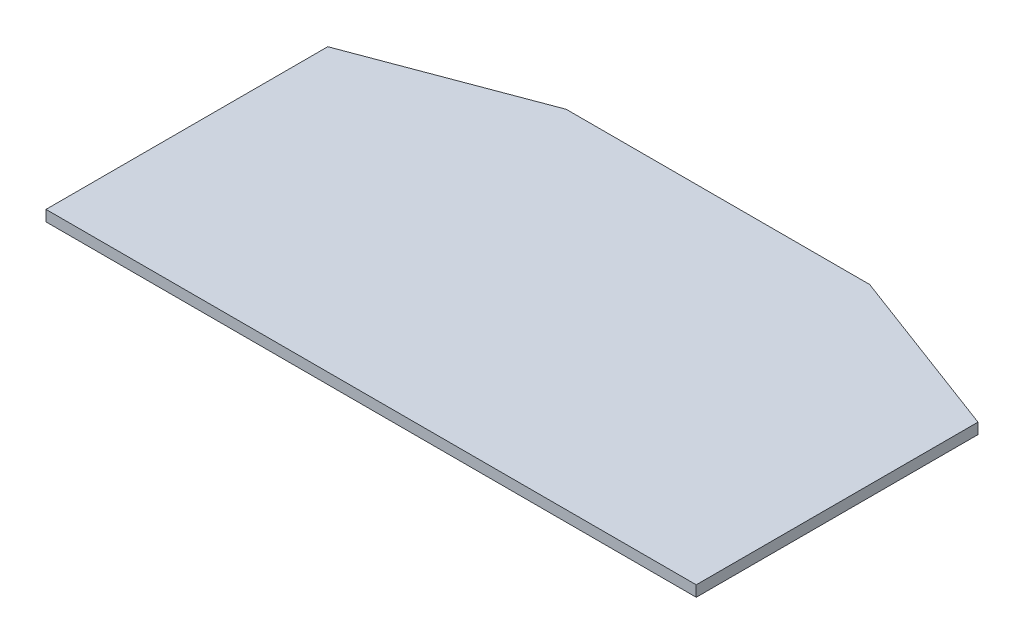
ISO-10303-21;
HEADER;
FILE_DESCRIPTION(('STEP AP214'),'2;1');
FILE_NAME('part.step','',(''),(''),'','','');
FILE_SCHEMA(('AUTOMOTIVE_DESIGN { 1 0 10303 214 1 1 1 1 }'));
ENDSEC;
DATA;
#1=APPLICATION_CONTEXT('core data for automotive mechanical design processes');
#2=APPLICATION_PROTOCOL_DEFINITION('international standard','automotive_design',2000,#1);
#3=PRODUCT_CONTEXT('',#1,'mechanical');
#4=PRODUCT('Part','Part','',(#3));
#5=PRODUCT_RELATED_PRODUCT_CATEGORY('part','',(#4));
#6=PRODUCT_DEFINITION_FORMATION('','',#4);
#7=PRODUCT_DEFINITION_CONTEXT('part definition',#1,'design');
#8=PRODUCT_DEFINITION('design','',#6,#7);
#9=PRODUCT_DEFINITION_SHAPE('','',#8);
#10=(LENGTH_UNIT() NAMED_UNIT(*) SI_UNIT(.MILLI.,.METRE.));
#11=(NAMED_UNIT(*) PLANE_ANGLE_UNIT() SI_UNIT($,.RADIAN.));
#12=(NAMED_UNIT(*) SI_UNIT($,.STERADIAN.) SOLID_ANGLE_UNIT());
#13=UNCERTAINTY_MEASURE_WITH_UNIT(LENGTH_MEASURE(1.E-05),#10,'distance_accuracy_value','');
#14=(GEOMETRIC_REPRESENTATION_CONTEXT(3) GLOBAL_UNCERTAINTY_ASSIGNED_CONTEXT((#13)) GLOBAL_UNIT_ASSIGNED_CONTEXT((#10,
#11,#12)) REPRESENTATION_CONTEXT('',''));
#15=CARTESIAN_POINT('',(0.,0.,0.));
#16=DIRECTION('',(0.,0.,1.));
#17=DIRECTION('',(1.,0.,0.));
#18=AXIS2_PLACEMENT_3D('',#15,#16,#17);
#19=CARTESIAN_POINT('',(-92.921646993215,12.7,-89.0184341791368));
#20=DIRECTION('',(1.,0.,0.));
#21=DIRECTION('',(0.,0.,-1.));
#22=AXIS2_PLACEMENT_3D('',#19,#20,#21);
#23=PLANE('',#22);
#24=DIRECTION('',(0.,0.,1.));
#25=VECTOR('',#24,1.);
#26=CARTESIAN_POINT('',(-92.921646993215,0.,-89.0184341791368));
#27=LINE('',#26,#25);
#28=CARTESIAN_POINT('',(-92.921646993215,0.,-419.218434179137));
#29=VERTEX_POINT('',#28);
#30=CARTESIAN_POINT('',(-92.921646993215,0.,-89.0184341791368));
#31=VERTEX_POINT('',#30);
#32=EDGE_CURVE('E117',#29,#31,#27,.T.);
#33=ORIENTED_EDGE('',*,*,#32,.T.);
#34=DIRECTION('',(0.,-1.,0.));
#35=VECTOR('',#34,1.);
#36=CARTESIAN_POINT('',(-92.921646993215,12.7,-89.0184341791368));
#37=LINE('',#36,#35);
#38=CARTESIAN_POINT('',(-92.921646993215,12.7,-89.0184341791368));
#39=VERTEX_POINT('',#38);
#40=EDGE_CURVE('E11',#39,#31,#37,.T.);
#41=ORIENTED_EDGE('',*,*,#40,.F.);
#42=DIRECTION('',(0.,0.,1.));
#43=VECTOR('',#42,1.);
#44=CARTESIAN_POINT('',(-92.921646993215,12.7,-89.0184341791368));
#45=LINE('',#44,#43);
#46=CARTESIAN_POINT('',(-92.921646993215,12.7,-419.218434179137));
#47=VERTEX_POINT('',#46);
#48=EDGE_CURVE('E127',#47,#39,#45,.T.);
#49=ORIENTED_EDGE('',*,*,#48,.F.);
#50=DIRECTION('',(0.,-1.,0.));
#51=VECTOR('',#50,1.);
#52=CARTESIAN_POINT('',(-92.921646993215,12.7,-419.218434179137));
#53=LINE('',#52,#51);
#54=EDGE_CURVE('E113',#47,#29,#53,.T.);
#55=ORIENTED_EDGE('',*,*,#54,.T.);
#56=EDGE_LOOP('',(#33,#41,#49,#55));
#57=FACE_BOUND('',#56,.T.);
#58=ADVANCED_FACE('F33',(#57),#23,.F.);
#59=CARTESIAN_POINT('',(-92.921646993215,12.7,-89.0184341791368));
#60=DIRECTION('',(0.,0.,-1.));
#61=DIRECTION('',(-1.,0.,0.));
#62=AXIS2_PLACEMENT_3D('',#59,#60,#61);
#63=PLANE('',#62);
#64=DIRECTION('',(1.,0.,0.));
#65=VECTOR('',#64,1.);
#66=CARTESIAN_POINT('',(-92.921646993215,0.,-89.0184341791368));
#67=LINE('',#66,#65);
#68=CARTESIAN_POINT('',(669.078353006785,0.,-89.0184341791368));
#69=VERTEX_POINT('',#68);
#70=EDGE_CURVE('E120',#31,#69,#67,.T.);
#71=ORIENTED_EDGE('',*,*,#70,.T.);
#72=DIRECTION('',(0.,-1.,0.));
#73=VECTOR('',#72,1.);
#74=CARTESIAN_POINT('',(669.078353006785,12.7,-89.0184341791368));
#75=LINE('',#74,#73);
#76=CARTESIAN_POINT('',(669.078353006785,12.7,-89.0184341791368));
#77=VERTEX_POINT('',#76);
#78=EDGE_CURVE('E41',#77,#69,#75,.T.);
#79=ORIENTED_EDGE('',*,*,#78,.F.);
#80=DIRECTION('',(1.,0.,0.));
#81=VECTOR('',#80,1.);
#82=CARTESIAN_POINT('',(-92.921646993215,12.7,-89.0184341791368));
#83=LINE('',#82,#81);
#84=EDGE_CURVE('E86',#39,#77,#83,.T.);
#85=ORIENTED_EDGE('',*,*,#84,.F.);
#86=ORIENTED_EDGE('',*,*,#40,.T.);
#87=EDGE_LOOP('',(#71,#79,#85,#86));
#88=FACE_BOUND('',#87,.T.);
#89=ADVANCED_FACE('F151',(#88),#63,.F.);
#90=CARTESIAN_POINT('',(669.078353006785,12.7,-89.0184341791368));
#91=DIRECTION('',(-1.,0.,0.));
#92=DIRECTION('',(0.,0.,1.));
#93=AXIS2_PLACEMENT_3D('',#90,#91,#92);
#94=PLANE('',#93);
#95=DIRECTION('',(0.,0.,-1.));
#96=VECTOR('',#95,1.);
#97=CARTESIAN_POINT('',(669.078353006785,0.,-89.0184341791368));
#98=LINE('',#97,#96);
#99=CARTESIAN_POINT('',(669.078353006785,0.,-419.218434179137));
#100=VERTEX_POINT('',#99);
#101=EDGE_CURVE('E122',#69,#100,#98,.T.);
#102=ORIENTED_EDGE('',*,*,#101,.T.);
#103=DIRECTION('',(0.,-1.,0.));
#104=VECTOR('',#103,1.);
#105=CARTESIAN_POINT('',(669.078353006785,12.7,-419.218434179137));
#106=LINE('',#105,#104);
#107=CARTESIAN_POINT('',(669.078353006785,12.7,-419.218434179137));
#108=VERTEX_POINT('',#107);
#109=EDGE_CURVE('E108',#108,#100,#106,.T.);
#110=ORIENTED_EDGE('',*,*,#109,.F.);
#111=DIRECTION('',(0.,0.,-1.));
#112=VECTOR('',#111,1.);
#113=CARTESIAN_POINT('',(669.078353006785,12.7,-89.0184341791368));
#114=LINE('',#113,#112);
#115=EDGE_CURVE('E99',#77,#108,#114,.T.);
#116=ORIENTED_EDGE('',*,*,#115,.F.);
#117=ORIENTED_EDGE('',*,*,#78,.T.);
#118=EDGE_LOOP('',(#102,#110,#116,#117));
#119=FACE_BOUND('',#118,.T.);
#120=ADVANCED_FACE('F133',(#119),#94,.F.);
#121=CARTESIAN_POINT('',(465.878353006785,12.7,-495.418434179137));
#122=DIRECTION('',(-0.351123441588392,0.,0.936329177569044));
#123=DIRECTION('',(0.936329177569045,0.,0.351123441588392));
#124=AXIS2_PLACEMENT_3D('',#121,#122,#123);
#125=PLANE('',#124);
#126=DIRECTION('',(-0.936329177569045,0.,-0.351123441588392));
#127=VECTOR('',#126,1.);
#128=CARTESIAN_POINT('',(465.878353006785,0.,-495.418434179137));
#129=LINE('',#128,#127);
#130=CARTESIAN_POINT('',(465.878353006785,0.,-495.418434179137));
#131=VERTEX_POINT('',#130);
#132=EDGE_CURVE('E107',#100,#131,#129,.T.);
#133=ORIENTED_EDGE('',*,*,#132,.T.);
#134=DIRECTION('',(0.,-1.,0.));
#135=VECTOR('',#134,1.);
#136=CARTESIAN_POINT('',(465.878353006785,12.7,-495.418434179137));
#137=LINE('',#136,#135);
#138=CARTESIAN_POINT('',(465.878353006785,12.7,-495.418434179137));
#139=VERTEX_POINT('',#138);
#140=EDGE_CURVE('E104',#139,#131,#137,.T.);
#141=ORIENTED_EDGE('',*,*,#140,.F.);
#142=DIRECTION('',(-0.936329177569045,0.,-0.351123441588392));
#143=VECTOR('',#142,1.);
#144=CARTESIAN_POINT('',(465.878353006785,12.7,-495.418434179137));
#145=LINE('',#144,#143);
#146=EDGE_CURVE('E93',#108,#139,#145,.T.);
#147=ORIENTED_EDGE('',*,*,#146,.F.);
#148=ORIENTED_EDGE('',*,*,#109,.T.);
#149=EDGE_LOOP('',(#133,#141,#147,#148));
#150=FACE_BOUND('',#149,.T.);
#151=ADVANCED_FACE('F105',(#150),#125,.F.);
#152=CARTESIAN_POINT('',(110.278353006785,12.7,-495.418434179137));
#153=DIRECTION('',(0.,0.,1.));
#154=DIRECTION('',(1.,0.,0.));
#155=AXIS2_PLACEMENT_3D('',#152,#153,#154);
#156=PLANE('',#155);
#157=DIRECTION('',(-1.,0.,0.));
#158=VECTOR('',#157,1.);
#159=CARTESIAN_POINT('',(110.278353006785,0.,-495.418434179137));
#160=LINE('',#159,#158);
#161=CARTESIAN_POINT('',(110.278353006785,0.,-495.418434179137));
#162=VERTEX_POINT('',#161);
#163=EDGE_CURVE('E72',#131,#162,#160,.T.);
#164=ORIENTED_EDGE('',*,*,#163,.T.);
#165=DIRECTION('',(0.,-1.,0.));
#166=VECTOR('',#165,1.);
#167=CARTESIAN_POINT('',(110.278353006785,12.7,-495.418434179137));
#168=LINE('',#167,#166);
#169=CARTESIAN_POINT('',(110.278353006785,12.7,-495.418434179137));
#170=VERTEX_POINT('',#169);
#171=EDGE_CURVE('E109',#170,#162,#168,.T.);
#172=ORIENTED_EDGE('',*,*,#171,.F.);
#173=DIRECTION('',(-1.,0.,0.));
#174=VECTOR('',#173,1.);
#175=CARTESIAN_POINT('',(110.278353006785,12.7,-495.418434179137));
#176=LINE('',#175,#174);
#177=EDGE_CURVE('E97',#139,#170,#176,.T.);
#178=ORIENTED_EDGE('',*,*,#177,.F.);
#179=ORIENTED_EDGE('',*,*,#140,.T.);
#180=EDGE_LOOP('',(#164,#172,#178,#179));
#181=FACE_BOUND('',#180,.T.);
#182=ADVANCED_FACE('F111',(#181),#156,.F.);
#183=CARTESIAN_POINT('',(110.278353006785,12.7,-495.418434179137));
#184=DIRECTION('',(0.351123441588392,0.,0.936329177569044));
#185=DIRECTION('',(0.936329177569045,0.,-0.351123441588392));
#186=AXIS2_PLACEMENT_3D('',#183,#184,#185);
#187=PLANE('',#186);
#188=DIRECTION('',(-0.936329177569045,0.,0.351123441588392));
#189=VECTOR('',#188,1.);
#190=CARTESIAN_POINT('',(110.278353006785,0.,-495.418434179137));
#191=LINE('',#190,#189);
#192=EDGE_CURVE('E78',#162,#29,#191,.T.);
#193=ORIENTED_EDGE('',*,*,#192,.T.);
#194=ORIENTED_EDGE('',*,*,#54,.F.);
#195=DIRECTION('',(-0.936329177569045,0.,0.351123441588392));
#196=VECTOR('',#195,1.);
#197=CARTESIAN_POINT('',(110.278353006785,12.7,-495.418434179137));
#198=LINE('',#197,#196);
#199=EDGE_CURVE('E49',#170,#47,#198,.T.);
#200=ORIENTED_EDGE('',*,*,#199,.F.);
#201=ORIENTED_EDGE('',*,*,#171,.T.);
#202=EDGE_LOOP('',(#193,#194,#200,#201));
#203=FACE_BOUND('',#202,.T.);
#204=ADVANCED_FACE('F140',(#203),#187,.F.);
#205=CARTESIAN_POINT('',(0.,12.7,0.));
#206=DIRECTION('',(0.,-1.,0.));
#207=DIRECTION('',(0.,0.,-1.));
#208=AXIS2_PLACEMENT_3D('',#205,#206,#207);
#209=PLANE('',#208);
#210=ORIENTED_EDGE('',*,*,#48,.T.);
#211=ORIENTED_EDGE('',*,*,#84,.T.);
#212=ORIENTED_EDGE('',*,*,#115,.T.);
#213=ORIENTED_EDGE('',*,*,#146,.T.);
#214=ORIENTED_EDGE('',*,*,#177,.T.);
#215=ORIENTED_EDGE('',*,*,#199,.T.);
#216=EDGE_LOOP('',(#210,#211,#212,#213,#214,#215));
#217=FACE_BOUND('',#216,.T.);
#218=ADVANCED_FACE('F95',(#217),#209,.F.);
#219=CARTESIAN_POINT('',(0.,0.,0.));
#220=DIRECTION('',(0.,-1.,0.));
#221=DIRECTION('',(0.,0.,-1.));
#222=AXIS2_PLACEMENT_3D('',#219,#220,#221);
#223=PLANE('',#222);
#224=ORIENTED_EDGE('',*,*,#32,.F.);
#225=ORIENTED_EDGE('',*,*,#192,.F.);
#226=ORIENTED_EDGE('',*,*,#163,.F.);
#227=ORIENTED_EDGE('',*,*,#132,.F.);
#228=ORIENTED_EDGE('',*,*,#101,.F.);
#229=ORIENTED_EDGE('',*,*,#70,.F.);
#230=EDGE_LOOP('',(#224,#225,#226,#227,#228,#229));
#231=FACE_BOUND('',#230,.T.);
#232=ADVANCED_FACE('F136',(#231),#223,.T.);
#233=CLOSED_SHELL('',(#58,#89,#120,#151,#182,#204,#218,#232));
#234=MANIFOLD_SOLID_BREP('B2',#233);
#235=ADVANCED_BREP_SHAPE_REPRESENTATION('',(#18,#234),#14);
#236=SHAPE_DEFINITION_REPRESENTATION(#9,#235);
ENDSEC;
END-ISO-10303-21;
